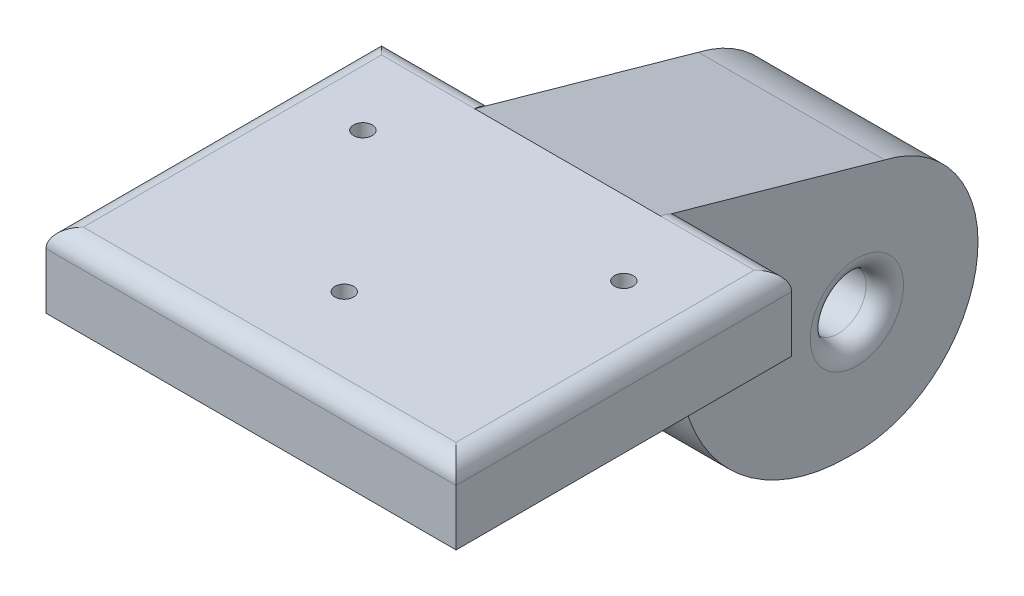
ISO-10303-21;
HEADER;
FILE_DESCRIPTION(('STEP AP214'),'2;1');
FILE_NAME('part.step','',(''),(''),'','','');
FILE_SCHEMA(('AUTOMOTIVE_DESIGN { 1 0 10303 214 1 1 1 1 }'));
ENDSEC;
DATA;
#1=APPLICATION_CONTEXT('core data for automotive mechanical design processes');
#2=APPLICATION_PROTOCOL_DEFINITION('international standard','automotive_design',2000,#1);
#3=PRODUCT_CONTEXT('',#1,'mechanical');
#4=PRODUCT('Part','Part','',(#3));
#5=PRODUCT_RELATED_PRODUCT_CATEGORY('part','',(#4));
#6=PRODUCT_DEFINITION_FORMATION('','',#4);
#7=PRODUCT_DEFINITION_CONTEXT('part definition',#1,'design');
#8=PRODUCT_DEFINITION('design','',#6,#7);
#9=PRODUCT_DEFINITION_SHAPE('','',#8);
#10=(LENGTH_UNIT() NAMED_UNIT(*) SI_UNIT(.MILLI.,.METRE.));
#11=(NAMED_UNIT(*) PLANE_ANGLE_UNIT() SI_UNIT($,.RADIAN.));
#12=(NAMED_UNIT(*) SI_UNIT($,.STERADIAN.) SOLID_ANGLE_UNIT());
#13=UNCERTAINTY_MEASURE_WITH_UNIT(LENGTH_MEASURE(1.E-05),#10,'distance_accuracy_value','');
#14=(GEOMETRIC_REPRESENTATION_CONTEXT(3) GLOBAL_UNCERTAINTY_ASSIGNED_CONTEXT((#13)) GLOBAL_UNIT_ASSIGNED_CONTEXT((#10,
#11,#12)) REPRESENTATION_CONTEXT('',''));
#15=CARTESIAN_POINT('',(0.,0.,0.));
#16=DIRECTION('',(0.,0.,1.));
#17=DIRECTION('',(1.,0.,0.));
#18=AXIS2_PLACEMENT_3D('',#15,#16,#17);
#19=CARTESIAN_POINT('',(0.,0.,0.));
#20=DIRECTION('',(0.,1.,0.));
#21=DIRECTION('',(0.,0.,1.));
#22=AXIS2_PLACEMENT_3D('',#19,#20,#21);
#23=PLANE('',#22);
#24=CARTESIAN_POINT('',(-1.24087591240878,0.,-20.3576642335766));
#25=DIRECTION('',(0.,1.,0.));
#26=DIRECTION('',(0.,0.,1.));
#27=AXIS2_PLACEMENT_3D('',#24,#25,#26);
#28=CIRCLE('',#27,0.5);
#29=CARTESIAN_POINT('',(-1.24087591240878,0.,-19.8576642335766));
#30=VERTEX_POINT('',#29);
#31=EDGE_CURVE('E405',#30,#30,#28,.T.);
#32=ORIENTED_EDGE('',*,*,#31,.T.);
#33=EDGE_LOOP('',(#32));
#34=FACE_BOUND('',#33,.T.);
#35=CARTESIAN_POINT('',(-8.24087591240878,0.,-12.3576642335766));
#36=DIRECTION('',(0.,1.,0.));
#37=DIRECTION('',(0.,0.,1.));
#38=AXIS2_PLACEMENT_3D('',#35,#36,#37);
#39=CIRCLE('',#38,0.500000000000001);
#40=CARTESIAN_POINT('',(-8.24087591240878,0.,-11.8576642335766));
#41=VERTEX_POINT('',#40);
#42=EDGE_CURVE('E409',#41,#41,#39,.T.);
#43=ORIENTED_EDGE('',*,*,#42,.T.);
#44=EDGE_LOOP('',(#43));
#45=FACE_BOUND('',#44,.T.);
#46=CARTESIAN_POINT('',(-15.2408759124088,0.,-20.3576642335766));
#47=DIRECTION('',(0.,1.,0.));
#48=DIRECTION('',(0.,0.,1.));
#49=AXIS2_PLACEMENT_3D('',#46,#47,#48);
#50=CIRCLE('',#49,0.500000000000001);
#51=CARTESIAN_POINT('',(-15.2408759124088,0.,-19.8576642335766));
#52=VERTEX_POINT('',#51);
#53=EDGE_CURVE('E413',#52,#52,#50,.T.);
#54=ORIENTED_EDGE('',*,*,#53,.T.);
#55=EDGE_LOOP('',(#54));
#56=FACE_BOUND('',#55,.T.);
#57=DIRECTION('',(1.,0.,0.));
#58=VECTOR('',#57,1.);
#59=CARTESIAN_POINT('',(0.,0.,-23.3576642335766));
#60=LINE('',#59,#58);
#61=CARTESIAN_POINT('',(-13.2408759124088,0.,-23.3576642335766));
#62=VERTEX_POINT('',#61);
#63=CARTESIAN_POINT('',(-3.24087591240879,0.,-23.3576642335766));
#64=VERTEX_POINT('',#63);
#65=EDGE_CURVE('E288',#62,#64,#60,.T.);
#66=ORIENTED_EDGE('',*,*,#65,.T.);
#67=DIRECTION('',(0.,0.,-1.));
#68=VECTOR('',#67,1.);
#69=CARTESIAN_POINT('',(-3.24087591240878,0.,0.));
#70=LINE('',#69,#68);
#71=CARTESIAN_POINT('',(-3.24087591240879,0.,-25.3576642335766));
#72=VERTEX_POINT('',#71);
#73=EDGE_CURVE('E292',#64,#72,#70,.T.);
#74=ORIENTED_EDGE('',*,*,#73,.T.);
#75=DIRECTION('',(1.,0.,0.));
#76=VECTOR('',#75,1.);
#77=CARTESIAN_POINT('',(0.,0.,-25.3576642335766));
#78=LINE('',#77,#76);
#79=CARTESIAN_POINT('',(2.75912408759122,0.,-25.3576642335766));
#80=VERTEX_POINT('',#79);
#81=EDGE_CURVE('E193',#72,#80,#78,.T.);
#82=ORIENTED_EDGE('',*,*,#81,.T.);
#83=DIRECTION('',(0.,0.,1.));
#84=VECTOR('',#83,1.);
#85=CARTESIAN_POINT('',(2.75912408759122,0.,0.));
#86=LINE('',#85,#84);
#87=CARTESIAN_POINT('',(2.75912408759122,0.,-7.35766423357664));
#88=VERTEX_POINT('',#87);
#89=EDGE_CURVE('E175',#80,#88,#86,.T.);
#90=ORIENTED_EDGE('',*,*,#89,.T.);
#91=DIRECTION('',(1.,0.,0.));
#92=VECTOR('',#91,1.);
#93=CARTESIAN_POINT('',(0.,0.,-7.35766423357664));
#94=LINE('',#93,#92);
#95=CARTESIAN_POINT('',(-19.2408759124088,0.,-7.35766423357664));
#96=VERTEX_POINT('',#95);
#97=EDGE_CURVE('E197',#96,#88,#94,.T.);
#98=ORIENTED_EDGE('',*,*,#97,.F.);
#99=DIRECTION('',(0.,0.,1.));
#100=VECTOR('',#99,1.);
#101=CARTESIAN_POINT('',(-19.2408759124088,0.,0.));
#102=LINE('',#101,#100);
#103=CARTESIAN_POINT('',(-19.2408759124088,0.,-25.3576642335766));
#104=VERTEX_POINT('',#103);
#105=EDGE_CURVE('E393',#104,#96,#102,.T.);
#106=ORIENTED_EDGE('',*,*,#105,.F.);
#107=DIRECTION('',(-1.,0.,0.));
#108=VECTOR('',#107,1.);
#109=CARTESIAN_POINT('',(-16.4817518248176,0.,-25.3576642335766));
#110=LINE('',#109,#108);
#111=CARTESIAN_POINT('',(-13.2408759124088,0.,-25.3576642335766));
#112=VERTEX_POINT('',#111);
#113=EDGE_CURVE('E360',#112,#104,#110,.T.);
#114=ORIENTED_EDGE('',*,*,#113,.F.);
#115=DIRECTION('',(0.,0.,1.));
#116=VECTOR('',#115,1.);
#117=CARTESIAN_POINT('',(-13.2408759124088,0.,0.));
#118=LINE('',#117,#116);
#119=EDGE_CURVE('E268',#112,#62,#118,.T.);
#120=ORIENTED_EDGE('',*,*,#119,.T.);
#121=EDGE_LOOP('',(#66,#74,#82,#90,#98,#106,#114,#120));
#122=FACE_BOUND('',#121,.T.);
#123=ADVANCED_FACE('F41',(#34,#45,#56,#122),#23,.F.);
#124=CARTESIAN_POINT('',(2.75912408759122,4.,0.));
#125=DIRECTION('',(1.,0.,0.));
#126=DIRECTION('',(0.,0.,-1.));
#127=AXIS2_PLACEMENT_3D('',#124,#125,#126);
#128=PLANE('',#127);
#129=DIRECTION('',(0.,-1.,0.));
#130=VECTOR('',#129,1.);
#131=CARTESIAN_POINT('',(2.75912408759122,4.,-25.3576642335766));
#132=LINE('',#131,#130);
#133=CARTESIAN_POINT('',(2.75912408759122,3.,-25.3576642335766));
#134=VERTEX_POINT('',#133);
#135=EDGE_CURVE('E208',#134,#80,#132,.T.);
#136=ORIENTED_EDGE('',*,*,#135,.F.);
#137=DIRECTION('',(0.,0.,1.));
#138=VECTOR('',#137,1.);
#139=CARTESIAN_POINT('',(2.75912408759122,3.,0.));
#140=LINE('',#139,#138);
#141=CARTESIAN_POINT('',(2.75912408759122,3.,-7.35766423357664));
#142=VERTEX_POINT('',#141);
#143=EDGE_CURVE('E231',#134,#142,#140,.T.);
#144=ORIENTED_EDGE('',*,*,#143,.T.);
#145=DIRECTION('',(0.,-1.,0.));
#146=VECTOR('',#145,1.);
#147=CARTESIAN_POINT('',(2.75912408759122,4.,-7.35766423357664));
#148=LINE('',#147,#146);
#149=EDGE_CURVE('E201',#142,#88,#148,.T.);
#150=ORIENTED_EDGE('',*,*,#149,.T.);
#151=ORIENTED_EDGE('',*,*,#89,.F.);
#152=EDGE_LOOP('',(#136,#144,#150,#151));
#153=FACE_BOUND('',#152,.T.);
#154=ADVANCED_FACE('F331',(#153),#128,.T.);
#155=CARTESIAN_POINT('',(0.,4.,-25.3576642335766));
#156=DIRECTION('',(0.,0.,-1.));
#157=DIRECTION('',(-1.,0.,0.));
#158=AXIS2_PLACEMENT_3D('',#155,#156,#157);
#159=PLANE('',#158);
#160=DIRECTION('',(0.,-1.,0.));
#161=VECTOR('',#160,1.);
#162=CARTESIAN_POINT('',(-3.24087591240879,4.,-25.3576642335766));
#163=LINE('',#162,#161);
#164=CARTESIAN_POINT('',(-3.24087591240879,3.,-25.3576642335766));
#165=VERTEX_POINT('',#164);
#166=EDGE_CURVE('E204',#165,#72,#163,.T.);
#167=ORIENTED_EDGE('',*,*,#166,.F.);
#168=DIRECTION('',(1.,0.,0.));
#169=VECTOR('',#168,1.);
#170=CARTESIAN_POINT('',(0.,3.,-25.3576642335766));
#171=LINE('',#170,#169);
#172=EDGE_CURVE('E211',#165,#134,#171,.T.);
#173=ORIENTED_EDGE('',*,*,#172,.T.);
#174=ORIENTED_EDGE('',*,*,#135,.T.);
#175=ORIENTED_EDGE('',*,*,#81,.F.);
#176=EDGE_LOOP('',(#167,#173,#174,#175));
#177=FACE_BOUND('',#176,.T.);
#178=ADVANCED_FACE('F319',(#177),#159,.T.);
#179=CARTESIAN_POINT('',(-3.24087591240878,4.,0.));
#180=DIRECTION('',(-1.,0.,0.));
#181=DIRECTION('',(0.,0.,1.));
#182=AXIS2_PLACEMENT_3D('',#179,#180,#181);
#183=PLANE('',#182);
#184=CARTESIAN_POINT('',(-3.24087591240879,-5.7,-34.8576642335766));
#185=DIRECTION('',(-1.,0.,0.));
#186=DIRECTION('',(0.,0.,1.));
#187=AXIS2_PLACEMENT_3D('',#184,#185,#186);
#188=CIRCLE('',#187,2.5);
#189=CARTESIAN_POINT('',(-3.24087591240879,-5.7,-32.3576642335766));
#190=VERTEX_POINT('',#189);
#191=EDGE_CURVE('E255',#190,#190,#188,.T.);
#192=ORIENTED_EDGE('',*,*,#191,.T.);
#193=EDGE_LOOP('',(#192));
#194=FACE_BOUND('',#193,.T.);
#195=CARTESIAN_POINT('',(-3.24087591240879,-5.7,-34.8576642335766));
#196=DIRECTION('',(1.,0.,0.));
#197=DIRECTION('',(0.,0.,-1.));
#198=AXIS2_PLACEMENT_3D('',#195,#196,#197);
#199=CIRCLE('',#198,6.5);
#200=CARTESIAN_POINT('',(-3.24087591240879,-12.1921305013964,-34.5379119031099));
#201=VERTEX_POINT('',#200);
#202=CARTESIAN_POINT('',(-3.24087591240879,0.624555320336759,-36.3576642335766));
#203=VERTEX_POINT('',#202);
#204=EDGE_CURVE('E171',#201,#203,#199,.T.);
#205=ORIENTED_EDGE('',*,*,#204,.T.);
#206=DIRECTION('',(0.,0.270778634132189,0.962641642199997));
#207=VECTOR('',#206,1.);
#208=CARTESIAN_POINT('',(-3.24087591240879,0.624555320336759,-36.3576642335766));
#209=LINE('',#208,#207);
#210=CARTESIAN_POINT('',(-3.24087591240879,3.85335786259501,-24.878989811644));
#211=VERTEX_POINT('',#210);
#212=EDGE_CURVE('E153',#203,#211,#209,.T.);
#213=ORIENTED_EDGE('',*,*,#212,.T.);
#214=CARTESIAN_POINT('',(-3.24087591240879,3.,-24.3576642335766));
#215=DIRECTION('',(-1.,0.,0.));
#216=DIRECTION('',(0.,0.,1.));
#217=AXIS2_PLACEMENT_3D('',#214,#215,#216);
#218=CIRCLE('',#217,1.);
#219=EDGE_CURVE('E259',#211,#165,#218,.T.);
#220=ORIENTED_EDGE('',*,*,#219,.T.);
#221=ORIENTED_EDGE('',*,*,#166,.T.);
#222=ORIENTED_EDGE('',*,*,#73,.F.);
#223=CARTESIAN_POINT('',(-3.24087591240879,-2.,-23.3576642335766));
#224=DIRECTION('',(-1.,0.,0.));
#225=DIRECTION('',(0.,0.,1.));
#226=AXIS2_PLACEMENT_3D('',#223,#224,#225);
#227=CIRCLE('',#226,2.);
#228=CARTESIAN_POINT('',(-3.24087591240879,-2.,-25.3576642335766));
#229=VERTEX_POINT('',#228);
#230=EDGE_CURVE('E298',#64,#229,#227,.T.);
#231=ORIENTED_EDGE('',*,*,#230,.T.);
#232=DIRECTION('',(0.,-1.,0.));
#233=VECTOR('',#232,1.);
#234=CARTESIAN_POINT('',(-3.24087591240879,0.,-25.3576642335766));
#235=LINE('',#234,#233);
#236=CARTESIAN_POINT('',(-3.24087591240879,-3.19213050139637,-25.3576642335766));
#237=VERTEX_POINT('',#236);
#238=EDGE_CURVE('E186',#229,#237,#235,.T.);
#239=ORIENTED_EDGE('',*,*,#238,.T.);
#240=CARTESIAN_POINT('',(-3.24087591240879,-3.19213050139637,-34.3576642335766));
#241=DIRECTION('',(-1.,0.,0.));
#242=DIRECTION('',(0.,0.,1.));
#243=AXIS2_PLACEMENT_3D('',#240,#241,#242);
#244=CIRCLE('',#243,9.);
#245=CARTESIAN_POINT('',(-3.24087591240879,-12.1921305013964,-34.3576642335766));
#246=VERTEX_POINT('',#245);
#247=EDGE_CURVE('E64',#237,#246,#244,.F.);
#248=ORIENTED_EDGE('',*,*,#247,.T.);
#249=DIRECTION('',(0.,0.,-1.));
#250=VECTOR('',#249,1.);
#251=CARTESIAN_POINT('',(-3.24087591240878,-12.1921305013964,0.));
#252=LINE('',#251,#250);
#253=EDGE_CURVE('E179',#246,#201,#252,.T.);
#254=ORIENTED_EDGE('',*,*,#253,.T.);
#255=EDGE_LOOP('',(#205,#213,#220,#221,#222,#231,#239,#248,#254));
#256=FACE_BOUND('',#255,.T.);
#257=ADVANCED_FACE('F178',(#194,#256),#183,.F.);
#258=CARTESIAN_POINT('',(0.,4.,-7.35766423357664));
#259=DIRECTION('',(0.,0.,-1.));
#260=DIRECTION('',(-1.,0.,0.));
#261=AXIS2_PLACEMENT_3D('',#258,#259,#260);
#262=PLANE('',#261);
#263=ORIENTED_EDGE('',*,*,#149,.F.);
#264=DIRECTION('',(1.,0.,0.));
#265=VECTOR('',#264,1.);
#266=CARTESIAN_POINT('',(-19.2408759124088,3.,-7.35766423357664));
#267=LINE('',#266,#265);
#268=CARTESIAN_POINT('',(-19.2408759124088,3.,-7.35766423357664));
#269=VERTEX_POINT('',#268);
#270=EDGE_CURVE('E234',#142,#269,#267,.F.);
#271=ORIENTED_EDGE('',*,*,#270,.T.);
#272=DIRECTION('',(0.,-1.,0.));
#273=VECTOR('',#272,1.);
#274=CARTESIAN_POINT('',(-19.2408759124088,4.,-7.35766423357664));
#275=LINE('',#274,#273);
#276=EDGE_CURVE('E353',#269,#96,#275,.T.);
#277=ORIENTED_EDGE('',*,*,#276,.T.);
#278=ORIENTED_EDGE('',*,*,#97,.T.);
#279=EDGE_LOOP('',(#263,#271,#277,#278));
#280=FACE_BOUND('',#279,.T.);
#281=ADVANCED_FACE('F335',(#280),#262,.F.);
#282=CARTESIAN_POINT('',(0.,4.,0.));
#283=DIRECTION('',(0.,1.,0.));
#284=DIRECTION('',(0.,0.,1.));
#285=AXIS2_PLACEMENT_3D('',#282,#283,#284);
#286=PLANE('',#285);
#287=DIRECTION('',(-1.,0.,0.));
#288=VECTOR('',#287,1.);
#289=CARTESIAN_POINT('',(-3.24087591240879,4.,-24.3576642335766));
#290=LINE('',#289,#288);
#291=CARTESIAN_POINT('',(-3.24087591240879,4.,-24.3576642335766));
#292=VERTEX_POINT('',#291);
#293=CARTESIAN_POINT('',(-13.2408759124088,4.,-24.3576642335766));
#294=VERTEX_POINT('',#293);
#295=EDGE_CURVE('E164',#292,#294,#290,.T.);
#296=ORIENTED_EDGE('',*,*,#295,.T.);
#297=DIRECTION('',(-1.,0.,0.));
#298=VECTOR('',#297,1.);
#299=CARTESIAN_POINT('',(-19.2408759124088,4.,-24.3576642335766));
#300=LINE('',#299,#298);
#301=CARTESIAN_POINT('',(-18.2408759124088,4.,-24.3576642335766));
#302=VERTEX_POINT('',#301);
#303=EDGE_CURVE('E218',#294,#302,#300,.T.);
#304=ORIENTED_EDGE('',*,*,#303,.T.);
#305=DIRECTION('',(0.,0.,1.));
#306=VECTOR('',#305,1.);
#307=CARTESIAN_POINT('',(-18.2408759124088,4.,-7.35766423357664));
#308=LINE('',#307,#306);
#309=CARTESIAN_POINT('',(-18.2408759124088,4.,-8.35766423357664));
#310=VERTEX_POINT('',#309);
#311=EDGE_CURVE('E215',#302,#310,#308,.T.);
#312=ORIENTED_EDGE('',*,*,#311,.T.);
#313=DIRECTION('',(1.,0.,0.));
#314=VECTOR('',#313,1.);
#315=CARTESIAN_POINT('',(2.75912408759122,4.,-8.35766423357664));
#316=LINE('',#315,#314);
#317=CARTESIAN_POINT('',(1.75912408759122,4.,-8.35766423357664));
#318=VERTEX_POINT('',#317);
#319=EDGE_CURVE('E221',#310,#318,#316,.T.);
#320=ORIENTED_EDGE('',*,*,#319,.T.);
#321=DIRECTION('',(0.,0.,1.));
#322=VECTOR('',#321,1.);
#323=CARTESIAN_POINT('',(1.75912408759122,4.,0.));
#324=LINE('',#323,#322);
#325=CARTESIAN_POINT('',(1.75912408759122,4.,-24.3576642335766));
#326=VERTEX_POINT('',#325);
#327=EDGE_CURVE('E224',#318,#326,#324,.F.);
#328=ORIENTED_EDGE('',*,*,#327,.T.);
#329=DIRECTION('',(1.,0.,0.));
#330=VECTOR('',#329,1.);
#331=CARTESIAN_POINT('',(0.,4.,-24.3576642335766));
#332=LINE('',#331,#330);
#333=EDGE_CURVE('E227',#326,#292,#332,.F.);
#334=ORIENTED_EDGE('',*,*,#333,.T.);
#335=EDGE_LOOP('',(#296,#304,#312,#320,#328,#334));
#336=FACE_BOUND('',#335,.T.);
#337=CARTESIAN_POINT('',(-1.24087591240878,4.,-20.3576642335766));
#338=DIRECTION('',(0.,1.,0.));
#339=DIRECTION('',(0.,0.,1.));
#340=AXIS2_PLACEMENT_3D('',#337,#338,#339);
#341=CIRCLE('',#340,0.5);
#342=CARTESIAN_POINT('',(-1.24087591240878,4.,-19.8576642335766));
#343=VERTEX_POINT('',#342);
#344=EDGE_CURVE('E417',#343,#343,#341,.T.);
#345=ORIENTED_EDGE('',*,*,#344,.F.);
#346=EDGE_LOOP('',(#345));
#347=FACE_BOUND('',#346,.T.);
#348=CARTESIAN_POINT('',(-8.24087591240878,4.,-12.3576642335766));
#349=DIRECTION('',(0.,1.,0.));
#350=DIRECTION('',(0.,0.,1.));
#351=AXIS2_PLACEMENT_3D('',#348,#349,#350);
#352=CIRCLE('',#351,0.500000000000001);
#353=CARTESIAN_POINT('',(-8.24087591240878,4.,-11.8576642335766));
#354=VERTEX_POINT('',#353);
#355=EDGE_CURVE('E421',#354,#354,#352,.T.);
#356=ORIENTED_EDGE('',*,*,#355,.F.);
#357=EDGE_LOOP('',(#356));
#358=FACE_BOUND('',#357,.T.);
#359=CARTESIAN_POINT('',(-15.2408759124088,4.,-20.3576642335766));
#360=DIRECTION('',(0.,1.,0.));
#361=DIRECTION('',(0.,0.,-1.));
#362=AXIS2_PLACEMENT_3D('',#359,#360,#361);
#363=CIRCLE('',#362,0.500000000000001);
#364=CARTESIAN_POINT('',(-15.2408759124088,4.,-20.8576642335766));
#365=VERTEX_POINT('',#364);
#366=EDGE_CURVE('E284',#365,#365,#363,.T.);
#367=ORIENTED_EDGE('',*,*,#366,.F.);
#368=EDGE_LOOP('',(#367));
#369=FACE_BOUND('',#368,.T.);
#370=ADVANCED_FACE('F438',(#336,#347,#358,#369),#286,.T.);
#371=CARTESIAN_POINT('',(-8.24087591240879,-5.7,-34.8576642335766));
#372=DIRECTION('',(1.,0.,0.));
#373=DIRECTION('',(0.,0.,-1.));
#374=AXIS2_PLACEMENT_3D('',#371,#372,#373);
#375=CYLINDRICAL_SURFACE('',#374,6.5);
#376=ORIENTED_EDGE('',*,*,#204,.F.);
#377=DIRECTION('',(1.,0.,0.));
#378=VECTOR('',#377,1.);
#379=CARTESIAN_POINT('',(-8.24087591240879,-12.1921305013964,-34.5379119031099));
#380=LINE('',#379,#378);
#381=CARTESIAN_POINT('',(-13.2408759124088,-12.1921305013964,-34.5379119031099));
#382=VERTEX_POINT('',#381);
#383=EDGE_CURVE('E176',#382,#201,#380,.T.);
#384=ORIENTED_EDGE('',*,*,#383,.F.);
#385=CARTESIAN_POINT('',(-13.2408759124088,-5.7,-34.8576642335766));
#386=DIRECTION('',(1.,0.,0.));
#387=DIRECTION('',(0.,0.,-1.));
#388=AXIS2_PLACEMENT_3D('',#385,#386,#387);
#389=CIRCLE('',#388,6.5);
#390=CARTESIAN_POINT('',(-13.2408759124088,0.624555320336759,-36.3576642335766));
#391=VERTEX_POINT('',#390);
#392=EDGE_CURVE('E173',#382,#391,#389,.T.);
#393=ORIENTED_EDGE('',*,*,#392,.T.);
#394=DIRECTION('',(1.,0.,0.));
#395=VECTOR('',#394,1.);
#396=CARTESIAN_POINT('',(-8.24087591240879,0.624555320336759,-36.3576642335766));
#397=LINE('',#396,#395);
#398=EDGE_CURVE('E157',#391,#203,#397,.T.);
#399=ORIENTED_EDGE('',*,*,#398,.T.);
#400=EDGE_LOOP('',(#376,#384,#393,#399));
#401=FACE_BOUND('',#400,.T.);
#402=ADVANCED_FACE('F169',(#401),#375,.T.);
#403=CARTESIAN_POINT('',(-8.24087591240879,-12.1921305013964,0.));
#404=DIRECTION('',(0.,-1.,0.));
#405=DIRECTION('',(0.,0.,-1.));
#406=AXIS2_PLACEMENT_3D('',#403,#404,#405);
#407=PLANE('',#406);
#408=ORIENTED_EDGE('',*,*,#253,.F.);
#409=DIRECTION('',(1.,0.,0.));
#410=VECTOR('',#409,1.);
#411=CARTESIAN_POINT('',(-8.24087591240879,-12.1921305013964,-34.3576642335766));
#412=LINE('',#411,#410);
#413=CARTESIAN_POINT('',(-13.2408759124088,-12.1921305013964,-34.3576642335766));
#414=VERTEX_POINT('',#413);
#415=EDGE_CURVE('E50',#246,#414,#412,.F.);
#416=ORIENTED_EDGE('',*,*,#415,.T.);
#417=DIRECTION('',(0.,0.,-1.));
#418=VECTOR('',#417,1.);
#419=CARTESIAN_POINT('',(-13.2408759124088,-12.1921305013964,0.));
#420=LINE('',#419,#418);
#421=EDGE_CURVE('E400',#414,#382,#420,.T.);
#422=ORIENTED_EDGE('',*,*,#421,.T.);
#423=ORIENTED_EDGE('',*,*,#383,.T.);
#424=EDGE_LOOP('',(#408,#416,#422,#423));
#425=FACE_BOUND('',#424,.T.);
#426=ADVANCED_FACE('F495',(#425),#407,.T.);
#427=CARTESIAN_POINT('',(-8.24087591240879,0.,-25.3576642335766));
#428=DIRECTION('',(0.,0.,1.));
#429=DIRECTION('',(1.,0.,0.));
#430=AXIS2_PLACEMENT_3D('',#427,#428,#429);
#431=PLANE('',#430);
#432=DIRECTION('',(0.,-1.,0.));
#433=VECTOR('',#432,1.);
#434=CARTESIAN_POINT('',(-13.2408759124088,0.,-25.3576642335766));
#435=LINE('',#434,#433);
#436=CARTESIAN_POINT('',(-13.2408759124088,-2.,-25.3576642335766));
#437=VERTEX_POINT('',#436);
#438=CARTESIAN_POINT('',(-13.2408759124088,-3.19213050139637,-25.3576642335766));
#439=VERTEX_POINT('',#438);
#440=EDGE_CURVE('E391',#437,#439,#435,.T.);
#441=ORIENTED_EDGE('',*,*,#440,.T.);
#442=DIRECTION('',(1.,0.,0.));
#443=VECTOR('',#442,1.);
#444=CARTESIAN_POINT('',(-8.24087591240879,-3.19213050139637,-25.3576642335766));
#445=LINE('',#444,#443);
#446=EDGE_CURVE('E304',#439,#237,#445,.T.);
#447=ORIENTED_EDGE('',*,*,#446,.T.);
#448=ORIENTED_EDGE('',*,*,#238,.F.);
#449=DIRECTION('',(1.,0.,0.));
#450=VECTOR('',#449,1.);
#451=CARTESIAN_POINT('',(-8.24087591240879,-2.,-25.3576642335766));
#452=LINE('',#451,#450);
#453=EDGE_CURVE('E295',#229,#437,#452,.F.);
#454=ORIENTED_EDGE('',*,*,#453,.T.);
#455=EDGE_LOOP('',(#441,#447,#448,#454));
#456=FACE_BOUND('',#455,.T.);
#457=ADVANCED_FACE('F384',(#456),#431,.T.);
#458=CARTESIAN_POINT('',(-8.24087591240879,-5.7,-34.8576642335766));
#459=DIRECTION('',(1.,0.,0.));
#460=DIRECTION('',(0.,0.,-1.));
#461=AXIS2_PLACEMENT_3D('',#458,#459,#460);
#462=CYLINDRICAL_SURFACE('',#461,1.5);
#463=CARTESIAN_POINT('',(-12.2408759124088,-5.7,-34.8576642335766));
#464=DIRECTION('',(-1.,0.,0.));
#465=DIRECTION('',(0.,0.,1.));
#466=AXIS2_PLACEMENT_3D('',#463,#464,#465);
#467=CIRCLE('',#466,1.5);
#468=CARTESIAN_POINT('',(-12.2408759124088,-5.7,-33.3576642335766));
#469=VERTEX_POINT('',#468);
#470=EDGE_CURVE('E251',#469,#469,#467,.T.);
#471=ORIENTED_EDGE('',*,*,#470,.T.);
#472=EDGE_LOOP('',(#471));
#473=FACE_BOUND('',#472,.T.);
#474=CARTESIAN_POINT('',(-4.24087591240879,-5.7,-34.8576642335766));
#475=DIRECTION('',(-1.,0.,0.));
#476=DIRECTION('',(0.,0.,1.));
#477=AXIS2_PLACEMENT_3D('',#474,#475,#476);
#478=CIRCLE('',#477,1.5);
#479=CARTESIAN_POINT('',(-4.24087591240879,-5.7,-33.3576642335766));
#480=VERTEX_POINT('',#479);
#481=EDGE_CURVE('E247',#480,#480,#478,.F.);
#482=ORIENTED_EDGE('',*,*,#481,.T.);
#483=EDGE_LOOP('',(#482));
#484=FACE_BOUND('',#483,.T.);
#485=ADVANCED_FACE('F502',(#473,#484),#462,.F.);
#486=CARTESIAN_POINT('',(-19.2408759124088,4.,0.));
#487=DIRECTION('',(1.,0.,0.));
#488=DIRECTION('',(0.,0.,-1.));
#489=AXIS2_PLACEMENT_3D('',#486,#487,#488);
#490=PLANE('',#489);
#491=ORIENTED_EDGE('',*,*,#276,.F.);
#492=DIRECTION('',(0.,0.,1.));
#493=VECTOR('',#492,1.);
#494=CARTESIAN_POINT('',(-19.2408759124088,3.,-25.3576642335766));
#495=LINE('',#494,#493);
#496=CARTESIAN_POINT('',(-19.2408759124088,3.,-25.3576642335766));
#497=VERTEX_POINT('',#496);
#498=EDGE_CURVE('E240',#269,#497,#495,.F.);
#499=ORIENTED_EDGE('',*,*,#498,.T.);
#500=DIRECTION('',(0.,-1.,0.));
#501=VECTOR('',#500,1.);
#502=CARTESIAN_POINT('',(-19.2408759124088,4.,-25.3576642335766));
#503=LINE('',#502,#501);
#504=EDGE_CURVE('E351',#497,#104,#503,.T.);
#505=ORIENTED_EDGE('',*,*,#504,.T.);
#506=ORIENTED_EDGE('',*,*,#105,.T.);
#507=EDGE_LOOP('',(#491,#499,#505,#506));
#508=FACE_BOUND('',#507,.T.);
#509=ADVANCED_FACE('F349',(#508),#490,.F.);
#510=CARTESIAN_POINT('',(-13.2408759124088,4.,0.));
#511=DIRECTION('',(-1.,0.,0.));
#512=DIRECTION('',(0.,0.,1.));
#513=AXIS2_PLACEMENT_3D('',#510,#511,#512);
#514=PLANE('',#513);
#515=DIRECTION('',(0.,0.270778634132189,0.962641642199997));
#516=VECTOR('',#515,1.);
#517=CARTESIAN_POINT('',(-13.2408759124088,0.624555320336759,-36.3576642335766));
#518=LINE('',#517,#516);
#519=CARTESIAN_POINT('',(-13.2408759124088,3.85335786259501,-24.878989811644));
#520=VERTEX_POINT('',#519);
#521=EDGE_CURVE('E373',#391,#520,#518,.T.);
#522=ORIENTED_EDGE('',*,*,#521,.F.);
#523=ORIENTED_EDGE('',*,*,#392,.F.);
#524=ORIENTED_EDGE('',*,*,#421,.F.);
#525=CARTESIAN_POINT('',(-13.2408759124088,-3.19213050139637,-34.3576642335766));
#526=DIRECTION('',(-1.,0.,0.));
#527=DIRECTION('',(0.,0.,1.));
#528=AXIS2_PLACEMENT_3D('',#525,#526,#527);
#529=CIRCLE('',#528,9.);
#530=EDGE_CURVE('E11',#414,#439,#529,.T.);
#531=ORIENTED_EDGE('',*,*,#530,.T.);
#532=ORIENTED_EDGE('',*,*,#440,.F.);
#533=CARTESIAN_POINT('',(-13.2408759124088,-2.,-23.3576642335766));
#534=DIRECTION('',(-1.,0.,0.));
#535=DIRECTION('',(0.,0.,1.));
#536=AXIS2_PLACEMENT_3D('',#533,#534,#535);
#537=CIRCLE('',#536,2.);
#538=EDGE_CURVE('E301',#437,#62,#537,.F.);
#539=ORIENTED_EDGE('',*,*,#538,.T.);
#540=ORIENTED_EDGE('',*,*,#119,.F.);
#541=DIRECTION('',(0.,-1.,0.));
#542=VECTOR('',#541,1.);
#543=CARTESIAN_POINT('',(-13.2408759124088,4.,-25.3576642335766));
#544=LINE('',#543,#542);
#545=CARTESIAN_POINT('',(-13.2408759124088,3.,-25.3576642335766));
#546=VERTEX_POINT('',#545);
#547=EDGE_CURVE('E363',#546,#112,#544,.T.);
#548=ORIENTED_EDGE('',*,*,#547,.F.);
#549=CARTESIAN_POINT('',(-13.2408759124088,3.,-24.3576642335766));
#550=DIRECTION('',(-1.,0.,0.));
#551=DIRECTION('',(0.,0.,1.));
#552=AXIS2_PLACEMENT_3D('',#549,#550,#551);
#553=CIRCLE('',#552,1.);
#554=EDGE_CURVE('E264',#546,#520,#553,.F.);
#555=ORIENTED_EDGE('',*,*,#554,.T.);
#556=EDGE_LOOP('',(#522,#523,#524,#531,#532,#539,#540,#548,#555));
#557=FACE_BOUND('',#556,.T.);
#558=CARTESIAN_POINT('',(-13.2408759124088,-5.7,-34.8576642335766));
#559=DIRECTION('',(-1.,0.,0.));
#560=DIRECTION('',(0.,0.,1.));
#561=AXIS2_PLACEMENT_3D('',#558,#559,#560);
#562=CIRCLE('',#561,2.5);
#563=CARTESIAN_POINT('',(-13.2408759124088,-5.7,-32.3576642335766));
#564=VERTEX_POINT('',#563);
#565=EDGE_CURVE('E243',#564,#564,#562,.F.);
#566=ORIENTED_EDGE('',*,*,#565,.T.);
#567=EDGE_LOOP('',(#566));
#568=FACE_BOUND('',#567,.T.);
#569=ADVANCED_FACE('F371',(#557,#568),#514,.T.);
#570=CARTESIAN_POINT('',(-16.4817518248176,4.,-25.3576642335766));
#571=DIRECTION('',(0.,0.,1.));
#572=DIRECTION('',(1.,0.,0.));
#573=AXIS2_PLACEMENT_3D('',#570,#571,#572);
#574=PLANE('',#573);
#575=ORIENTED_EDGE('',*,*,#504,.F.);
#576=DIRECTION('',(-1.,0.,0.));
#577=VECTOR('',#576,1.);
#578=CARTESIAN_POINT('',(-13.2408759124088,3.,-25.3576642335766));
#579=LINE('',#578,#577);
#580=EDGE_CURVE('E237',#497,#546,#579,.F.);
#581=ORIENTED_EDGE('',*,*,#580,.T.);
#582=ORIENTED_EDGE('',*,*,#547,.T.);
#583=ORIENTED_EDGE('',*,*,#113,.T.);
#584=EDGE_LOOP('',(#575,#581,#582,#583));
#585=FACE_BOUND('',#584,.T.);
#586=ADVANCED_FACE('F356',(#585),#574,.F.);
#587=CARTESIAN_POINT('',(-15.2408759124088,-1.,-20.3576642335766));
#588=DIRECTION('',(0.,1.,0.));
#589=DIRECTION('',(0.,0.,1.));
#590=AXIS2_PLACEMENT_3D('',#587,#588,#589);
#591=CYLINDRICAL_SURFACE('',#590,0.500000000000001);
#592=ORIENTED_EDGE('',*,*,#366,.T.);
#593=EDGE_LOOP('',(#592));
#594=FACE_BOUND('',#593,.T.);
#595=ORIENTED_EDGE('',*,*,#53,.F.);
#596=EDGE_LOOP('',(#595));
#597=FACE_BOUND('',#596,.T.);
#598=ADVANCED_FACE('F522',(#594,#597),#591,.F.);
#599=CARTESIAN_POINT('',(-8.24087591240878,-1.,-12.3576642335766));
#600=DIRECTION('',(0.,1.,0.));
#601=DIRECTION('',(0.,0.,1.));
#602=AXIS2_PLACEMENT_3D('',#599,#600,#601);
#603=CYLINDRICAL_SURFACE('',#602,0.500000000000001);
#604=ORIENTED_EDGE('',*,*,#355,.T.);
#605=EDGE_LOOP('',(#604));
#606=FACE_BOUND('',#605,.T.);
#607=ORIENTED_EDGE('',*,*,#42,.F.);
#608=EDGE_LOOP('',(#607));
#609=FACE_BOUND('',#608,.T.);
#610=ADVANCED_FACE('F527',(#606,#609),#603,.F.);
#611=CARTESIAN_POINT('',(-1.24087591240878,-1.,-20.3576642335766));
#612=DIRECTION('',(0.,1.,0.));
#613=DIRECTION('',(0.,0.,1.));
#614=AXIS2_PLACEMENT_3D('',#611,#612,#613);
#615=CYLINDRICAL_SURFACE('',#614,0.5);
#616=ORIENTED_EDGE('',*,*,#344,.T.);
#617=EDGE_LOOP('',(#616));
#618=FACE_BOUND('',#617,.T.);
#619=ORIENTED_EDGE('',*,*,#31,.F.);
#620=EDGE_LOOP('',(#619));
#621=FACE_BOUND('',#620,.T.);
#622=ADVANCED_FACE('F480',(#618,#621),#615,.F.);
#623=CARTESIAN_POINT('',(0.,3.,-24.3576642335766));
#624=DIRECTION('',(1.,0.,0.));
#625=DIRECTION('',(0.,0.,-1.));
#626=AXIS2_PLACEMENT_3D('',#623,#624,#625);
#627=CYLINDRICAL_SURFACE('',#626,1.);
#628=ORIENTED_EDGE('',*,*,#554,.F.);
#629=ORIENTED_EDGE('',*,*,#580,.F.);
#630=CARTESIAN_POINT('',(-18.2408759124088,3.,-24.3576642335766));
#631=DIRECTION('',(0.707106781186547,0.,-0.707106781186548));
#632=DIRECTION('',(-0.707106781186548,0.,-0.707106781186547));
#633=AXIS2_PLACEMENT_3D('',#630,#631,#632);
#634=ELLIPSE('',#633,1.41421356237309,1.);
#635=EDGE_CURVE('E280',#302,#497,#634,.F.);
#636=ORIENTED_EDGE('',*,*,#635,.F.);
#637=ORIENTED_EDGE('',*,*,#303,.F.);
#638=EDGE_CURVE('E263',#520,#294,#553,.F.);
#639=ORIENTED_EDGE('',*,*,#638,.F.);
#640=EDGE_LOOP('',(#628,#629,#636,#637,#639));
#641=FACE_BOUND('',#640,.T.);
#642=ADVANCED_FACE('F367',(#641),#627,.T.);
#643=CARTESIAN_POINT('',(-18.2408759124088,3.,0.));
#644=DIRECTION('',(0.,0.,-1.));
#645=DIRECTION('',(-1.,0.,0.));
#646=AXIS2_PLACEMENT_3D('',#643,#644,#645);
#647=CYLINDRICAL_SURFACE('',#646,1.);
#648=ORIENTED_EDGE('',*,*,#635,.T.);
#649=ORIENTED_EDGE('',*,*,#498,.F.);
#650=CARTESIAN_POINT('',(-18.2408759124088,3.,-8.35766423357664));
#651=DIRECTION('',(-0.707106781186548,0.,-0.707106781186547));
#652=DIRECTION('',(0.707106781186547,0.,-0.707106781186548));
#653=AXIS2_PLACEMENT_3D('',#650,#651,#652);
#654=ELLIPSE('',#653,1.41421356237309,1.);
#655=EDGE_CURVE('E276',#310,#269,#654,.F.);
#656=ORIENTED_EDGE('',*,*,#655,.F.);
#657=ORIENTED_EDGE('',*,*,#311,.F.);
#658=EDGE_LOOP('',(#648,#649,#656,#657));
#659=FACE_BOUND('',#658,.T.);
#660=ADVANCED_FACE('F345',(#659),#647,.T.);
#661=CARTESIAN_POINT('',(0.,3.,-8.35766423357664));
#662=DIRECTION('',(-1.,0.,0.));
#663=DIRECTION('',(0.,0.,1.));
#664=AXIS2_PLACEMENT_3D('',#661,#662,#663);
#665=CYLINDRICAL_SURFACE('',#664,1.);
#666=ORIENTED_EDGE('',*,*,#655,.T.);
#667=ORIENTED_EDGE('',*,*,#270,.F.);
#668=CARTESIAN_POINT('',(1.75912408759122,3.,-8.35766423357664));
#669=DIRECTION('',(-0.707106781186547,0.,0.707106781186547));
#670=DIRECTION('',(-0.707106781186547,0.,-0.707106781186547));
#671=AXIS2_PLACEMENT_3D('',#668,#669,#670);
#672=ELLIPSE('',#671,1.41421356237309,1.);
#673=EDGE_CURVE('E272',#318,#142,#672,.F.);
#674=ORIENTED_EDGE('',*,*,#673,.F.);
#675=ORIENTED_EDGE('',*,*,#319,.F.);
#676=EDGE_LOOP('',(#666,#667,#674,#675));
#677=FACE_BOUND('',#676,.T.);
#678=ADVANCED_FACE('F339',(#677),#665,.T.);
#679=CARTESIAN_POINT('',(1.75912408759122,3.,0.));
#680=DIRECTION('',(0.,0.,1.));
#681=DIRECTION('',(1.,0.,0.));
#682=AXIS2_PLACEMENT_3D('',#679,#680,#681);
#683=CYLINDRICAL_SURFACE('',#682,1.);
#684=ORIENTED_EDGE('',*,*,#673,.T.);
#685=ORIENTED_EDGE('',*,*,#143,.F.);
#686=CARTESIAN_POINT('',(1.75912408759122,3.,-24.3576642335766));
#687=DIRECTION('',(0.707106781186547,0.,0.707106781186547));
#688=DIRECTION('',(-0.707106781186547,0.,0.707106781186547));
#689=AXIS2_PLACEMENT_3D('',#686,#687,#688);
#690=ELLIPSE('',#689,1.41421356237309,1.);
#691=EDGE_CURVE('E269',#326,#134,#690,.F.);
#692=ORIENTED_EDGE('',*,*,#691,.F.);
#693=ORIENTED_EDGE('',*,*,#327,.F.);
#694=EDGE_LOOP('',(#684,#685,#692,#693));
#695=FACE_BOUND('',#694,.T.);
#696=ADVANCED_FACE('F327',(#695),#683,.T.);
#697=CARTESIAN_POINT('',(0.,3.,-24.3576642335766));
#698=DIRECTION('',(1.,0.,0.));
#699=DIRECTION('',(0.,0.,-1.));
#700=AXIS2_PLACEMENT_3D('',#697,#698,#699);
#701=CYLINDRICAL_SURFACE('',#700,1.);
#702=EDGE_CURVE('E260',#292,#211,#218,.T.);
#703=ORIENTED_EDGE('',*,*,#702,.F.);
#704=ORIENTED_EDGE('',*,*,#333,.F.);
#705=ORIENTED_EDGE('',*,*,#691,.T.);
#706=ORIENTED_EDGE('',*,*,#172,.F.);
#707=ORIENTED_EDGE('',*,*,#219,.F.);
#708=EDGE_LOOP('',(#703,#704,#705,#706,#707));
#709=FACE_BOUND('',#708,.T.);
#710=ADVANCED_FACE('F321',(#709),#701,.T.);
#711=CARTESIAN_POINT('',(-12.2408759124088,-5.7,-34.8576642335766));
#712=DIRECTION('',(-1.,0.,0.));
#713=DIRECTION('',(0.,0.,1.));
#714=AXIS2_PLACEMENT_3D('',#711,#712,#713);
#715=TOROIDAL_SURFACE('',#714,2.5,1.);
#716=ORIENTED_EDGE('',*,*,#470,.F.);
#717=EDGE_LOOP('',(#716));
#718=FACE_BOUND('',#717,.T.);
#719=ORIENTED_EDGE('',*,*,#565,.F.);
#720=EDGE_LOOP('',(#719));
#721=FACE_BOUND('',#720,.T.);
#722=ADVANCED_FACE('F471',(#718,#721),#715,.T.);
#723=CARTESIAN_POINT('',(-4.24087591240879,-5.7,-34.8576642335766));
#724=DIRECTION('',(-1.,0.,0.));
#725=DIRECTION('',(0.,0.,1.));
#726=AXIS2_PLACEMENT_3D('',#723,#724,#725);
#727=TOROIDAL_SURFACE('',#726,2.5,1.);
#728=ORIENTED_EDGE('',*,*,#191,.F.);
#729=EDGE_LOOP('',(#728));
#730=FACE_BOUND('',#729,.T.);
#731=ORIENTED_EDGE('',*,*,#481,.F.);
#732=EDGE_LOOP('',(#731));
#733=FACE_BOUND('',#732,.T.);
#734=ADVANCED_FACE('F483',(#730,#733),#727,.T.);
#735=CARTESIAN_POINT('',(0.,-2.,-23.3576642335766));
#736=DIRECTION('',(1.,0.,0.));
#737=DIRECTION('',(0.,0.,-1.));
#738=AXIS2_PLACEMENT_3D('',#735,#736,#737);
#739=CYLINDRICAL_SURFACE('',#738,2.);
#740=ORIENTED_EDGE('',*,*,#538,.F.);
#741=ORIENTED_EDGE('',*,*,#453,.F.);
#742=ORIENTED_EDGE('',*,*,#230,.F.);
#743=ORIENTED_EDGE('',*,*,#65,.F.);
#744=EDGE_LOOP('',(#740,#741,#742,#743));
#745=FACE_BOUND('',#744,.T.);
#746=ADVANCED_FACE('F389',(#745),#739,.F.);
#747=CARTESIAN_POINT('',(-8.24087591240879,-3.19213050139637,-34.3576642335766));
#748=DIRECTION('',(1.,0.,0.));
#749=DIRECTION('',(0.,0.,-1.));
#750=AXIS2_PLACEMENT_3D('',#747,#748,#749);
#751=CYLINDRICAL_SURFACE('',#750,9.);
#752=ORIENTED_EDGE('',*,*,#530,.F.);
#753=ORIENTED_EDGE('',*,*,#415,.F.);
#754=ORIENTED_EDGE('',*,*,#247,.F.);
#755=ORIENTED_EDGE('',*,*,#446,.F.);
#756=EDGE_LOOP('',(#752,#753,#754,#755));
#757=FACE_BOUND('',#756,.T.);
#758=ADVANCED_FACE('F43',(#757),#751,.T.);
#759=CARTESIAN_POINT('',(-3.24087591240879,0.624555320336759,-36.3576642335766));
#760=DIRECTION('',(0.,-0.962641642199997,0.270778634132189));
#761=DIRECTION('',(0.,-0.270778634132189,-0.962641642199997));
#762=AXIS2_PLACEMENT_3D('',#759,#760,#761);
#763=PLANE('',#762);
#764=ORIENTED_EDGE('',*,*,#521,.T.);
#765=EDGE_CURVE('E432',#520,#294,#518,.T.);
#766=ORIENTED_EDGE('',*,*,#765,.T.);
#767=ORIENTED_EDGE('',*,*,#295,.F.);
#768=EDGE_CURVE('E160',#211,#292,#209,.T.);
#769=ORIENTED_EDGE('',*,*,#768,.F.);
#770=ORIENTED_EDGE('',*,*,#212,.F.);
#771=ORIENTED_EDGE('',*,*,#398,.F.);
#772=EDGE_LOOP('',(#764,#766,#767,#769,#770,#771));
#773=FACE_BOUND('',#772,.T.);
#774=ADVANCED_FACE('F156',(#773),#763,.F.);
#775=CARTESIAN_POINT('',(-3.24087591240878,0.,0.));
#776=DIRECTION('',(1.,0.,0.));
#777=DIRECTION('',(0.,0.,-1.));
#778=AXIS2_PLACEMENT_3D('',#775,#776,#777);
#779=PLANE('',#778);
#780=ORIENTED_EDGE('',*,*,#702,.T.);
#781=ORIENTED_EDGE('',*,*,#768,.T.);
#782=EDGE_LOOP('',(#780,#781));
#783=FACE_BOUND('',#782,.T.);
#784=ADVANCED_FACE('F441',(#783),#779,.F.);
#785=CARTESIAN_POINT('',(-13.2408759124088,0.,0.));
#786=DIRECTION('',(1.,0.,0.));
#787=DIRECTION('',(0.,0.,-1.));
#788=AXIS2_PLACEMENT_3D('',#785,#786,#787);
#789=PLANE('',#788);
#790=ORIENTED_EDGE('',*,*,#765,.F.);
#791=ORIENTED_EDGE('',*,*,#638,.T.);
#792=EDGE_LOOP('',(#790,#791));
#793=FACE_BOUND('',#792,.T.);
#794=ADVANCED_FACE('F443',(#793),#789,.T.);
#795=CLOSED_SHELL('',(#123,#154,#178,#257,#281,#370,#402,#426,#457,#485,#509,#569,#586,#598,
#610,#622,#642,#660,#678,#696,#710,#722,#734,#746,#758,#774,#784,#794));
#796=MANIFOLD_SOLID_BREP('B2',#795);
#797=ADVANCED_BREP_SHAPE_REPRESENTATION('',(#18,#796),#14);
#798=SHAPE_DEFINITION_REPRESENTATION(#9,#797);
ENDSEC;
END-ISO-10303-21;
